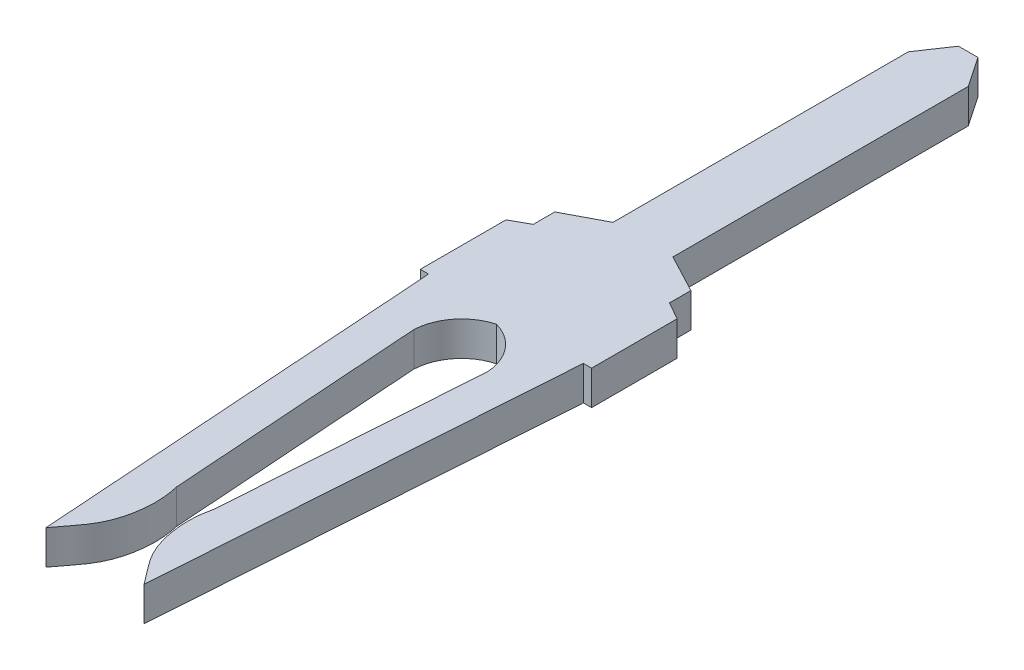
ISO-10303-21;
HEADER;
FILE_DESCRIPTION(('STEP AP214'),'2;1');
FILE_NAME('part.step','',(''),(''),'','','');
FILE_SCHEMA(('AUTOMOTIVE_DESIGN { 1 0 10303 214 1 1 1 1 }'));
ENDSEC;
DATA;
#1=APPLICATION_CONTEXT('core data for automotive mechanical design processes');
#2=APPLICATION_PROTOCOL_DEFINITION('international standard','automotive_design',2000,#1);
#3=PRODUCT_CONTEXT('',#1,'mechanical');
#4=PRODUCT('Part','Part','',(#3));
#5=PRODUCT_RELATED_PRODUCT_CATEGORY('part','',(#4));
#6=PRODUCT_DEFINITION_FORMATION('','',#4);
#7=PRODUCT_DEFINITION_CONTEXT('part definition',#1,'design');
#8=PRODUCT_DEFINITION('design','',#6,#7);
#9=PRODUCT_DEFINITION_SHAPE('','',#8);
#10=(LENGTH_UNIT() NAMED_UNIT(*) SI_UNIT(.MILLI.,.METRE.));
#11=(NAMED_UNIT(*) PLANE_ANGLE_UNIT() SI_UNIT($,.RADIAN.));
#12=(NAMED_UNIT(*) SI_UNIT($,.STERADIAN.) SOLID_ANGLE_UNIT());
#13=UNCERTAINTY_MEASURE_WITH_UNIT(LENGTH_MEASURE(1.E-05),#10,'distance_accuracy_value','');
#14=(GEOMETRIC_REPRESENTATION_CONTEXT(3) GLOBAL_UNCERTAINTY_ASSIGNED_CONTEXT((#13)) GLOBAL_UNIT_ASSIGNED_CONTEXT((#10,
#11,#12)) REPRESENTATION_CONTEXT('',''));
#15=CARTESIAN_POINT('',(0.,0.,0.));
#16=DIRECTION('',(0.,0.,1.));
#17=DIRECTION('',(1.,0.,0.));
#18=AXIS2_PLACEMENT_3D('',#15,#16,#17);
#19=CARTESIAN_POINT('',(7.14504922758908,0.200000000000005,-3.31529917991422));
#20=DIRECTION('',(-0.466469034336801,0.,0.884537528884384));
#21=DIRECTION('',(0.,1.,0.));
#22=AXIS2_PLACEMENT_3D('',#19,#20,#21);
#23=PLANE('',#22);
#24=DIRECTION('',(-0.884537528884384,0.,-0.466469034336801));
#25=VECTOR('',#24,1.);
#26=CARTESIAN_POINT('',(7.14504922758908,-0.199999999999995,-3.31529917991422));
#27=LINE('',#26,#25);
#28=CARTESIAN_POINT('',(7.14504922758908,-0.199999999999995,-3.31529917991422));
#29=VERTEX_POINT('',#28);
#30=CARTESIAN_POINT('',(6.7,-0.199999999999995,-3.55));
#31=VERTEX_POINT('',#30);
#32=EDGE_CURVE('E254',#29,#31,#27,.T.);
#33=ORIENTED_EDGE('',*,*,#32,.T.);
#34=DIRECTION('',(0.,-1.,0.));
#35=VECTOR('',#34,1.);
#36=CARTESIAN_POINT('',(6.7,0.200000000000005,-3.55));
#37=LINE('',#36,#35);
#38=CARTESIAN_POINT('',(6.7,0.200000000000005,-3.55));
#39=VERTEX_POINT('',#38);
#40=EDGE_CURVE('E340',#39,#31,#37,.T.);
#41=ORIENTED_EDGE('',*,*,#40,.F.);
#42=DIRECTION('',(-0.884537528884384,0.,-0.466469034336801));
#43=VECTOR('',#42,1.);
#44=CARTESIAN_POINT('',(7.14504922758908,0.200000000000005,-3.31529917991422));
#45=LINE('',#44,#43);
#46=CARTESIAN_POINT('',(7.14504922758908,0.200000000000005,-3.31529917991422));
#47=VERTEX_POINT('',#46);
#48=EDGE_CURVE('E312',#47,#39,#45,.T.);
#49=ORIENTED_EDGE('',*,*,#48,.F.);
#50=DIRECTION('',(0.,-1.,0.));
#51=VECTOR('',#50,1.);
#52=CARTESIAN_POINT('',(7.14504922758908,0.200000000000005,-3.31529917991422));
#53=LINE('',#52,#51);
#54=EDGE_CURVE('E11',#47,#29,#53,.T.);
#55=ORIENTED_EDGE('',*,*,#54,.T.);
#56=EDGE_LOOP('',(#33,#41,#49,#55));
#57=FACE_BOUND('',#56,.T.);
#58=ADVANCED_FACE('F16',(#57),#23,.F.);
#59=CARTESIAN_POINT('',(7.14504922758908,0.200000000000005,-3.0643625168085));
#60=DIRECTION('',(-1.,0.,0.));
#61=DIRECTION('',(0.,0.,1.));
#62=AXIS2_PLACEMENT_3D('',#59,#60,#61);
#63=PLANE('',#62);
#64=DIRECTION('',(0.,0.,-1.));
#65=VECTOR('',#64,1.);
#66=CARTESIAN_POINT('',(7.14504922758908,-0.199999999999995,-3.0643625168085));
#67=LINE('',#66,#65);
#68=CARTESIAN_POINT('',(7.14504922758908,-0.199999999999995,-3.0643625168085));
#69=VERTEX_POINT('',#68);
#70=EDGE_CURVE('E229',#69,#29,#67,.T.);
#71=ORIENTED_EDGE('',*,*,#70,.T.);
#72=ORIENTED_EDGE('',*,*,#54,.F.);
#73=DIRECTION('',(0.,0.,-1.));
#74=VECTOR('',#73,1.);
#75=CARTESIAN_POINT('',(7.14504922758908,0.200000000000005,-3.0643625168085));
#76=LINE('',#75,#74);
#77=CARTESIAN_POINT('',(7.14504922758908,0.200000000000005,-3.0643625168085));
#78=VERTEX_POINT('',#77);
#79=EDGE_CURVE('E309',#78,#47,#76,.T.);
#80=ORIENTED_EDGE('',*,*,#79,.F.);
#81=DIRECTION('',(0.,-1.,0.));
#82=VECTOR('',#81,1.);
#83=CARTESIAN_POINT('',(7.14504922758908,0.200000000000005,-3.0643625168085));
#84=LINE('',#83,#82);
#85=EDGE_CURVE('E23',#78,#69,#84,.T.);
#86=ORIENTED_EDGE('',*,*,#85,.T.);
#87=EDGE_LOOP('',(#71,#72,#80,#86));
#88=FACE_BOUND('',#87,.T.);
#89=ADVANCED_FACE('F397',(#88),#63,.F.);
#90=CARTESIAN_POINT('',(7.35,0.200000000000005,-2.95));
#91=DIRECTION('',(-0.48727320382818,0.,0.873249577630027));
#92=DIRECTION('',(0.,1.,0.));
#93=AXIS2_PLACEMENT_3D('',#90,#91,#92);
#94=PLANE('',#93);
#95=DIRECTION('',(-0.873249577630027,0.,-0.48727320382818));
#96=VECTOR('',#95,1.);
#97=CARTESIAN_POINT('',(7.35,-0.199999999999995,-2.95));
#98=LINE('',#97,#96);
#99=CARTESIAN_POINT('',(7.35,-0.199999999999995,-2.95));
#100=VERTEX_POINT('',#99);
#101=EDGE_CURVE('E225',#100,#69,#98,.T.);
#102=ORIENTED_EDGE('',*,*,#101,.T.);
#103=ORIENTED_EDGE('',*,*,#85,.F.);
#104=DIRECTION('',(-0.873249577630027,0.,-0.48727320382818));
#105=VECTOR('',#104,1.);
#106=CARTESIAN_POINT('',(7.35,0.200000000000005,-2.95));
#107=LINE('',#106,#105);
#108=CARTESIAN_POINT('',(7.35,0.200000000000005,-2.95));
#109=VERTEX_POINT('',#108);
#110=EDGE_CURVE('E306',#109,#78,#107,.T.);
#111=ORIENTED_EDGE('',*,*,#110,.F.);
#112=DIRECTION('',(0.,-1.,0.));
#113=VECTOR('',#112,1.);
#114=CARTESIAN_POINT('',(7.35,0.200000000000005,-2.95));
#115=LINE('',#114,#113);
#116=EDGE_CURVE('E276',#109,#100,#115,.T.);
#117=ORIENTED_EDGE('',*,*,#116,.T.);
#118=EDGE_LOOP('',(#102,#103,#111,#117));
#119=FACE_BOUND('',#118,.T.);
#120=ADVANCED_FACE('F386',(#119),#94,.F.);
#121=CARTESIAN_POINT('',(7.35,0.200000000000005,-1.95));
#122=DIRECTION('',(-1.,0.,0.));
#123=DIRECTION('',(0.,0.,1.));
#124=AXIS2_PLACEMENT_3D('',#121,#122,#123);
#125=PLANE('',#124);
#126=DIRECTION('',(0.,0.,-1.));
#127=VECTOR('',#126,1.);
#128=CARTESIAN_POINT('',(7.35,-0.199999999999995,-1.95));
#129=LINE('',#128,#127);
#130=CARTESIAN_POINT('',(7.35,-0.199999999999995,-1.95));
#131=VERTEX_POINT('',#130);
#132=EDGE_CURVE('E228',#131,#100,#129,.T.);
#133=ORIENTED_EDGE('',*,*,#132,.T.);
#134=ORIENTED_EDGE('',*,*,#116,.F.);
#135=DIRECTION('',(0.,0.,-1.));
#136=VECTOR('',#135,1.);
#137=CARTESIAN_POINT('',(7.35,0.200000000000005,-1.95));
#138=LINE('',#137,#136);
#139=CARTESIAN_POINT('',(7.35,0.200000000000005,-1.95));
#140=VERTEX_POINT('',#139);
#141=EDGE_CURVE('E303',#140,#109,#138,.T.);
#142=ORIENTED_EDGE('',*,*,#141,.F.);
#143=DIRECTION('',(0.,-1.,0.));
#144=VECTOR('',#143,1.);
#145=CARTESIAN_POINT('',(7.35,0.200000000000005,-1.95));
#146=LINE('',#145,#144);
#147=EDGE_CURVE('E383',#140,#131,#146,.T.);
#148=ORIENTED_EDGE('',*,*,#147,.T.);
#149=EDGE_LOOP('',(#133,#134,#142,#148));
#150=FACE_BOUND('',#149,.T.);
#151=ADVANCED_FACE('F392',(#150),#125,.F.);
#152=CARTESIAN_POINT('',(7.25406091182022,0.200000000000005,-1.95));
#153=DIRECTION('',(0.,0.,-1.));
#154=DIRECTION('',(0.,-1.,0.));
#155=AXIS2_PLACEMENT_3D('',#152,#153,#154);
#156=PLANE('',#155);
#157=DIRECTION('',(1.,0.,0.));
#158=VECTOR('',#157,1.);
#159=CARTESIAN_POINT('',(7.25406091182022,-0.199999999999995,-1.95));
#160=LINE('',#159,#158);
#161=CARTESIAN_POINT('',(7.25406091182022,-0.199999999999995,-1.95));
#162=VERTEX_POINT('',#161);
#163=EDGE_CURVE('E248',#162,#131,#160,.T.);
#164=ORIENTED_EDGE('',*,*,#163,.T.);
#165=ORIENTED_EDGE('',*,*,#147,.F.);
#166=DIRECTION('',(1.,0.,0.));
#167=VECTOR('',#166,1.);
#168=CARTESIAN_POINT('',(7.25406091182022,0.200000000000005,-1.95));
#169=LINE('',#168,#167);
#170=CARTESIAN_POINT('',(7.25406091182022,0.200000000000005,-1.95));
#171=VERTEX_POINT('',#170);
#172=EDGE_CURVE('E300',#171,#140,#169,.T.);
#173=ORIENTED_EDGE('',*,*,#172,.F.);
#174=DIRECTION('',(0.,-1.,0.));
#175=VECTOR('',#174,1.);
#176=CARTESIAN_POINT('',(7.25406091182022,0.200000000000005,-1.95));
#177=LINE('',#176,#175);
#178=EDGE_CURVE('E341',#171,#162,#177,.T.);
#179=ORIENTED_EDGE('',*,*,#178,.T.);
#180=EDGE_LOOP('',(#164,#165,#173,#179));
#181=FACE_BOUND('',#180,.T.);
#182=ADVANCED_FACE('F405',(#181),#156,.F.);
#183=CARTESIAN_POINT('',(6.7,0.200000000000005,-3.55));
#184=DIRECTION('',(-1.,0.,0.));
#185=DIRECTION('',(0.,0.,1.));
#186=AXIS2_PLACEMENT_3D('',#183,#184,#185);
#187=PLANE('',#186);
#188=DIRECTION('',(0.,0.,-1.));
#189=VECTOR('',#188,1.);
#190=CARTESIAN_POINT('',(6.7,-0.199999999999995,-3.55));
#191=LINE('',#190,#189);
#192=CARTESIAN_POINT('',(6.7,-0.199999999999995,-7.));
#193=VERTEX_POINT('',#192);
#194=EDGE_CURVE('E236',#31,#193,#191,.T.);
#195=ORIENTED_EDGE('',*,*,#194,.T.);
#196=DIRECTION('',(0.,-1.,0.));
#197=VECTOR('',#196,1.);
#198=CARTESIAN_POINT('',(6.7,0.200000000000005,-7.));
#199=LINE('',#198,#197);
#200=CARTESIAN_POINT('',(6.7,0.200000000000005,-7.));
#201=VERTEX_POINT('',#200);
#202=EDGE_CURVE('E370',#201,#193,#199,.T.);
#203=ORIENTED_EDGE('',*,*,#202,.F.);
#204=DIRECTION('',(0.,0.,-1.));
#205=VECTOR('',#204,1.);
#206=CARTESIAN_POINT('',(6.7,0.200000000000005,-3.55));
#207=LINE('',#206,#205);
#208=EDGE_CURVE('E315',#39,#201,#207,.T.);
#209=ORIENTED_EDGE('',*,*,#208,.F.);
#210=ORIENTED_EDGE('',*,*,#40,.T.);
#211=EDGE_LOOP('',(#195,#203,#209,#210));
#212=FACE_BOUND('',#211,.T.);
#213=ADVANCED_FACE('F464',(#212),#187,.F.);
#214=CARTESIAN_POINT('',(6.1940651826846,0.200000000000005,-1.27557004187954));
#215=DIRECTION('',(0.,-1.,0.));
#216=DIRECTION('',(0.,0.,-1.));
#217=AXIS2_PLACEMENT_3D('',#214,#215,#216);
#218=CYLINDRICAL_SURFACE('',#217,0.584698001459304);
#219=CARTESIAN_POINT('',(6.1940651826846,-0.199999999999995,-1.27557004187954));
#220=DIRECTION('',(0.,-1.,0.));
#221=DIRECTION('',(-1.,0.,0.));
#222=AXIS2_PLACEMENT_3D('',#219,#220,#221);
#223=CIRCLE('',#222,0.584698001459304);
#224=CARTESIAN_POINT('',(6.35,-0.199999999999995,-1.839091191136));
#225=VERTEX_POINT('',#224);
#226=CARTESIAN_POINT('',(6.77820423338275,-0.199999999999995,-1.30113021323976));
#227=VERTEX_POINT('',#226);
#228=EDGE_CURVE('E242',#225,#227,#223,.T.);
#229=ORIENTED_EDGE('',*,*,#228,.T.);
#230=DIRECTION('',(0.,-1.,0.));
#231=VECTOR('',#230,1.);
#232=CARTESIAN_POINT('',(6.77820423338275,0.200000000000005,-1.30113021323976));
#233=LINE('',#232,#231);
#234=CARTESIAN_POINT('',(6.77820423338275,0.200000000000005,-1.30113021323976));
#235=VERTEX_POINT('',#234);
#236=EDGE_CURVE('E338',#235,#227,#233,.T.);
#237=ORIENTED_EDGE('',*,*,#236,.F.);
#238=CARTESIAN_POINT('',(6.1940651826846,0.200000000000005,-1.27557004187954));
#239=DIRECTION('',(0.,-1.,0.));
#240=DIRECTION('',(-1.,0.,0.));
#241=AXIS2_PLACEMENT_3D('',#238,#239,#240);
#242=CIRCLE('',#241,0.584698001459304);
#243=CARTESIAN_POINT('',(6.35,0.200000000000005,-1.839091191136));
#244=VERTEX_POINT('',#243);
#245=EDGE_CURVE('E245',#244,#235,#242,.T.);
#246=ORIENTED_EDGE('',*,*,#245,.F.);
#247=DIRECTION('',(0.,-1.,0.));
#248=VECTOR('',#247,1.);
#249=CARTESIAN_POINT('',(6.35,0.200000000000005,-1.839091191136));
#250=LINE('',#249,#248);
#251=EDGE_CURVE('E337',#244,#225,#250,.T.);
#252=ORIENTED_EDGE('',*,*,#251,.T.);
#253=EDGE_LOOP('',(#229,#237,#246,#252));
#254=FACE_BOUND('',#253,.T.);
#255=ADVANCED_FACE('F420',(#254),#218,.F.);
#256=CARTESIAN_POINT('',(6.77820423338275,0.200000000000005,-1.30113021323976));
#257=DIRECTION('',(0.997626122448053,0.,0.0688630511178716));
#258=DIRECTION('',(0.,-1.,0.));
#259=AXIS2_PLACEMENT_3D('',#256,#257,#258);
#260=PLANE('',#259);
#261=DIRECTION('',(-0.0688630511178716,0.,0.997626122448053));
#262=VECTOR('',#261,1.);
#263=CARTESIAN_POINT('',(6.77820423338275,-0.199999999999995,-1.30113021323976));
#264=LINE('',#263,#262);
#265=CARTESIAN_POINT('',(6.57284949799642,-0.199999999999995,1.67386501372377));
#266=VERTEX_POINT('',#265);
#267=EDGE_CURVE('E215',#227,#266,#264,.T.);
#268=ORIENTED_EDGE('',*,*,#267,.T.);
#269=DIRECTION('',(0.,-1.,0.));
#270=VECTOR('',#269,1.);
#271=CARTESIAN_POINT('',(6.57284949799642,0.200000000000005,1.67386501372377));
#272=LINE('',#271,#270);
#273=CARTESIAN_POINT('',(6.57284949799642,0.200000000000005,1.67386501372377));
#274=VERTEX_POINT('',#273);
#275=EDGE_CURVE('E349',#274,#266,#272,.T.);
#276=ORIENTED_EDGE('',*,*,#275,.F.);
#277=DIRECTION('',(-0.0688630511178716,0.,0.997626122448053));
#278=VECTOR('',#277,1.);
#279=CARTESIAN_POINT('',(6.77820423338275,0.200000000000005,-1.30113021323976));
#280=LINE('',#279,#278);
#281=EDGE_CURVE('E263',#235,#274,#280,.T.);
#282=ORIENTED_EDGE('',*,*,#281,.F.);
#283=ORIENTED_EDGE('',*,*,#236,.T.);
#284=EDGE_LOOP('',(#268,#276,#282,#283));
#285=FACE_BOUND('',#284,.T.);
#286=ADVANCED_FACE('F416',(#285),#260,.F.);
#287=CARTESIAN_POINT('',(6.9227317315511,0.200000000000005,2.85));
#288=DIRECTION('',(-0.997626122448053,0.,-0.0688630511178712));
#289=DIRECTION('',(-0.0688630511178712,0.,0.997626122448053));
#290=AXIS2_PLACEMENT_3D('',#287,#288,#289);
#291=PLANE('',#290);
#292=DIRECTION('',(0.0688630511178712,0.,-0.997626122448053));
#293=VECTOR('',#292,1.);
#294=CARTESIAN_POINT('',(6.9227317315511,-0.199999999999995,2.85));
#295=LINE('',#294,#293);
#296=CARTESIAN_POINT('',(6.9227317315511,-0.199999999999995,2.85));
#297=VERTEX_POINT('',#296);
#298=EDGE_CURVE('E216',#297,#162,#295,.T.);
#299=ORIENTED_EDGE('',*,*,#298,.T.);
#300=ORIENTED_EDGE('',*,*,#178,.F.);
#301=DIRECTION('',(0.0688630511178712,0.,-0.997626122448053));
#302=VECTOR('',#301,1.);
#303=CARTESIAN_POINT('',(6.9227317315511,0.200000000000005,2.85));
#304=LINE('',#303,#302);
#305=CARTESIAN_POINT('',(6.9227317315511,0.200000000000005,2.85));
#306=VERTEX_POINT('',#305);
#307=EDGE_CURVE('E294',#306,#171,#304,.T.);
#308=ORIENTED_EDGE('',*,*,#307,.F.);
#309=DIRECTION('',(0.,-1.,0.));
#310=VECTOR('',#309,1.);
#311=CARTESIAN_POINT('',(6.9227317315511,0.200000000000005,2.85));
#312=LINE('',#311,#310);
#313=EDGE_CURVE('E350',#306,#297,#312,.T.);
#314=ORIENTED_EDGE('',*,*,#313,.T.);
#315=EDGE_LOOP('',(#299,#300,#308,#314));
#316=FACE_BOUND('',#315,.T.);
#317=ADVANCED_FACE('F410',(#316),#291,.F.);
#318=CARTESIAN_POINT('',(6.57284949799642,0.200000000000005,1.67386501372377));
#319=CARTESIAN_POINT('',(6.53798539804515,0.200000000000005,1.835112980862));
#320=CARTESIAN_POINT('',(6.53144115427702,0.200000000000005,2.11077566439518));
#321=CARTESIAN_POINT('',(6.62153964419782,0.200000000000005,2.49313848213162));
#322=CARTESIAN_POINT('',(6.84632285896388,0.200000000000005,2.74017511614905));
#323=CARTESIAN_POINT('',(6.9227317315511,0.200000000000005,2.85));
#324=(BOUNDED_CURVE() B_SPLINE_CURVE(3,(#318,#319,#320,#321,#322,#323),.UNSPECIFIED.,.F.,
.F.) B_SPLINE_CURVE_WITH_KNOTS((4,1,1,4),(0.,0.233999874933255,0.693587506264288,1.),
.UNSPECIFIED.) CURVE() GEOMETRIC_REPRESENTATION_ITEM() RATIONAL_B_SPLINE_CURVE((1.,1.,1.,1.,1.,1.)) REPRESENTATION_ITEM(''));
#325=DIRECTION('',(0.,-1.,0.));
#326=VECTOR('',#325,1.);
#327=SURFACE_OF_LINEAR_EXTRUSION('',#324,#326);
#328=CARTESIAN_POINT('',(6.57284949799642,-0.199999999999995,1.67386501372377));
#329=CARTESIAN_POINT('',(6.53798539804515,-0.199999999999995,1.835112980862));
#330=CARTESIAN_POINT('',(6.53144115427702,-0.199999999999995,2.11077566439518));
#331=CARTESIAN_POINT('',(6.62153964419782,-0.199999999999995,2.49313848213162));
#332=CARTESIAN_POINT('',(6.84632285896388,-0.199999999999995,2.74017511614905));
#333=CARTESIAN_POINT('',(6.9227317315511,-0.199999999999995,2.85));
#334=(BOUNDED_CURVE() B_SPLINE_CURVE(3,(#328,#329,#330,#331,#332,#333),.UNSPECIFIED.,.F.,
.F.) B_SPLINE_CURVE_WITH_KNOTS((4,1,1,4),(0.,0.233999874933255,0.693587506264288,1.),
.UNSPECIFIED.) CURVE() GEOMETRIC_REPRESENTATION_ITEM() RATIONAL_B_SPLINE_CURVE((1.,1.,1.,1.,1.,1.)) REPRESENTATION_ITEM(''));
#335=EDGE_CURVE('E210',#266,#297,#334,.T.);
#336=ORIENTED_EDGE('',*,*,#335,.T.);
#337=ORIENTED_EDGE('',*,*,#313,.F.);
#338=CARTESIAN_POINT('',(6.57284949799642,0.200000000000005,1.67386501372377));
#339=CARTESIAN_POINT('',(6.53798539804515,0.200000000000005,1.835112980862));
#340=CARTESIAN_POINT('',(6.53144115427702,0.200000000000005,2.11077566439518));
#341=CARTESIAN_POINT('',(6.62153964419782,0.200000000000005,2.49313848213162));
#342=CARTESIAN_POINT('',(6.84632285896388,0.200000000000005,2.74017511614905));
#343=CARTESIAN_POINT('',(6.9227317315511,0.200000000000005,2.85));
#344=(BOUNDED_CURVE() B_SPLINE_CURVE(3,(#338,#339,#340,#341,#342,#343),.UNSPECIFIED.,.F.,
.F.) B_SPLINE_CURVE_WITH_KNOTS((4,1,1,4),(0.,0.233999874933255,0.693587506264288,1.),
.UNSPECIFIED.) CURVE() GEOMETRIC_REPRESENTATION_ITEM() RATIONAL_B_SPLINE_CURVE((1.,1.,1.,1.,1.,1.)) REPRESENTATION_ITEM(''));
#345=EDGE_CURVE('E274',#274,#306,#344,.T.);
#346=ORIENTED_EDGE('',*,*,#345,.F.);
#347=ORIENTED_EDGE('',*,*,#275,.T.);
#348=EDGE_LOOP('',(#336,#337,#346,#347));
#349=FACE_BOUND('',#348,.T.);
#350=ADVANCED_FACE('F413',(#349),#327,.F.);
#351=CARTESIAN_POINT('',(6.35,0.200000000000005,-7.35));
#352=DIRECTION('',(0.,0.,1.));
#353=DIRECTION('',(1.,0.,0.));
#354=AXIS2_PLACEMENT_3D('',#351,#352,#353);
#355=PLANE('',#354);
#356=DIRECTION('',(-1.,0.,0.));
#357=VECTOR('',#356,1.);
#358=CARTESIAN_POINT('',(6.35,-0.199999999999995,-7.35));
#359=LINE('',#358,#357);
#360=CARTESIAN_POINT('',(6.46387375339661,-0.199999999999995,-7.35));
#361=VERTEX_POINT('',#360);
#362=CARTESIAN_POINT('',(6.23612624660339,-0.199999999999995,-7.35));
#363=VERTEX_POINT('',#362);
#364=EDGE_CURVE('E170',#361,#363,#359,.T.);
#365=ORIENTED_EDGE('',*,*,#364,.T.);
#366=DIRECTION('',(0.,-1.,0.));
#367=VECTOR('',#366,1.);
#368=CARTESIAN_POINT('',(6.23612624660339,0.200000000000005,-7.35));
#369=LINE('',#368,#367);
#370=CARTESIAN_POINT('',(6.23612624660339,0.200000000000005,-7.35));
#371=VERTEX_POINT('',#370);
#372=EDGE_CURVE('E174',#371,#363,#369,.T.);
#373=ORIENTED_EDGE('',*,*,#372,.F.);
#374=DIRECTION('',(-1.,0.,0.));
#375=VECTOR('',#374,1.);
#376=CARTESIAN_POINT('',(6.35,0.200000000000005,-7.35));
#377=LINE('',#376,#375);
#378=CARTESIAN_POINT('',(6.46387375339661,0.200000000000005,-7.35));
#379=VERTEX_POINT('',#378);
#380=EDGE_CURVE('E323',#379,#371,#377,.T.);
#381=ORIENTED_EDGE('',*,*,#380,.F.);
#382=DIRECTION('',(0.,-1.,0.));
#383=VECTOR('',#382,1.);
#384=CARTESIAN_POINT('',(6.46387375339661,0.200000000000005,-7.35));
#385=LINE('',#384,#383);
#386=EDGE_CURVE('E176',#379,#361,#385,.T.);
#387=ORIENTED_EDGE('',*,*,#386,.T.);
#388=EDGE_LOOP('',(#365,#373,#381,#387));
#389=FACE_BOUND('',#388,.T.);
#390=ADVANCED_FACE('F172',(#389),#355,.F.);
#391=CARTESIAN_POINT('',(6.7,0.200000000000005,-7.));
#392=DIRECTION('',(-0.828984571628172,0.,0.559271472544824));
#393=DIRECTION('',(0.,1.,0.));
#394=AXIS2_PLACEMENT_3D('',#391,#392,#393);
#395=PLANE('',#394);
#396=DIRECTION('',(-0.559271472544824,0.,-0.828984571628172));
#397=VECTOR('',#396,1.);
#398=CARTESIAN_POINT('',(6.7,-0.199999999999995,-7.));
#399=LINE('',#398,#397);
#400=EDGE_CURVE('E181',#193,#361,#399,.T.);
#401=ORIENTED_EDGE('',*,*,#400,.T.);
#402=ORIENTED_EDGE('',*,*,#386,.F.);
#403=DIRECTION('',(-0.559271472544824,0.,-0.828984571628172));
#404=VECTOR('',#403,1.);
#405=CARTESIAN_POINT('',(6.7,0.200000000000005,-7.));
#406=LINE('',#405,#404);
#407=EDGE_CURVE('E320',#201,#379,#406,.T.);
#408=ORIENTED_EDGE('',*,*,#407,.F.);
#409=ORIENTED_EDGE('',*,*,#202,.T.);
#410=EDGE_LOOP('',(#401,#402,#408,#409));
#411=FACE_BOUND('',#410,.T.);
#412=ADVANCED_FACE('F467',(#411),#395,.F.);
#413=CARTESIAN_POINT('',(6.,0.200000000000005,-7.));
#414=DIRECTION('',(1.,0.,0.));
#415=DIRECTION('',(0.,1.,0.));
#416=AXIS2_PLACEMENT_3D('',#413,#414,#415);
#417=PLANE('',#416);
#418=DIRECTION('',(0.,0.,1.));
#419=VECTOR('',#418,1.);
#420=CARTESIAN_POINT('',(6.,-0.199999999999995,-7.));
#421=LINE('',#420,#419);
#422=CARTESIAN_POINT('',(6.,-0.199999999999995,-7.));
#423=VERTEX_POINT('',#422);
#424=CARTESIAN_POINT('',(6.,-0.199999999999995,-3.55));
#425=VERTEX_POINT('',#424);
#426=EDGE_CURVE('E195',#423,#425,#421,.T.);
#427=ORIENTED_EDGE('',*,*,#426,.T.);
#428=DIRECTION('',(0.,-1.,0.));
#429=VECTOR('',#428,1.);
#430=CARTESIAN_POINT('',(6.,0.200000000000005,-3.55));
#431=LINE('',#430,#429);
#432=CARTESIAN_POINT('',(6.,0.200000000000005,-3.55));
#433=VERTEX_POINT('',#432);
#434=EDGE_CURVE('E182',#433,#425,#431,.T.);
#435=ORIENTED_EDGE('',*,*,#434,.F.);
#436=DIRECTION('',(0.,0.,1.));
#437=VECTOR('',#436,1.);
#438=CARTESIAN_POINT('',(6.,0.200000000000005,-7.));
#439=LINE('',#438,#437);
#440=CARTESIAN_POINT('',(6.,0.200000000000005,-7.));
#441=VERTEX_POINT('',#440);
#442=EDGE_CURVE('E191',#441,#433,#439,.T.);
#443=ORIENTED_EDGE('',*,*,#442,.F.);
#444=DIRECTION('',(0.,-1.,0.));
#445=VECTOR('',#444,1.);
#446=CARTESIAN_POINT('',(6.,0.200000000000005,-7.));
#447=LINE('',#446,#445);
#448=EDGE_CURVE('E197',#441,#423,#447,.T.);
#449=ORIENTED_EDGE('',*,*,#448,.T.);
#450=EDGE_LOOP('',(#427,#435,#443,#449));
#451=FACE_BOUND('',#450,.T.);
#452=ADVANCED_FACE('F469',(#451),#417,.F.);
#453=CARTESIAN_POINT('',(5.35,0.200000000000005,-2.95));
#454=DIRECTION('',(1.,0.,0.));
#455=DIRECTION('',(0.,1.,0.));
#456=AXIS2_PLACEMENT_3D('',#453,#454,#455);
#457=PLANE('',#456);
#458=DIRECTION('',(0.,0.,1.));
#459=VECTOR('',#458,1.);
#460=CARTESIAN_POINT('',(5.35,-0.199999999999995,-2.95));
#461=LINE('',#460,#459);
#462=CARTESIAN_POINT('',(5.35,-0.199999999999995,-2.95));
#463=VERTEX_POINT('',#462);
#464=CARTESIAN_POINT('',(5.35,-0.199999999999995,-1.95));
#465=VERTEX_POINT('',#464);
#466=EDGE_CURVE('E364',#463,#465,#461,.T.);
#467=ORIENTED_EDGE('',*,*,#466,.T.);
#468=DIRECTION('',(0.,-1.,0.));
#469=VECTOR('',#468,1.);
#470=CARTESIAN_POINT('',(5.35,0.200000000000005,-1.95));
#471=LINE('',#470,#469);
#472=CARTESIAN_POINT('',(5.35,0.200000000000005,-1.95));
#473=VERTEX_POINT('',#472);
#474=EDGE_CURVE('E378',#473,#465,#471,.T.);
#475=ORIENTED_EDGE('',*,*,#474,.F.);
#476=DIRECTION('',(0.,0.,1.));
#477=VECTOR('',#476,1.);
#478=CARTESIAN_POINT('',(5.35,0.200000000000005,-2.95));
#479=LINE('',#478,#477);
#480=CARTESIAN_POINT('',(5.35,0.200000000000005,-2.95));
#481=VERTEX_POINT('',#480);
#482=EDGE_CURVE('E230',#481,#473,#479,.T.);
#483=ORIENTED_EDGE('',*,*,#482,.F.);
#484=DIRECTION('',(0.,-1.,0.));
#485=VECTOR('',#484,1.);
#486=CARTESIAN_POINT('',(5.35,0.200000000000005,-2.95));
#487=LINE('',#486,#485);
#488=EDGE_CURVE('E38',#481,#463,#487,.T.);
#489=ORIENTED_EDGE('',*,*,#488,.T.);
#490=EDGE_LOOP('',(#467,#475,#483,#489));
#491=FACE_BOUND('',#490,.T.);
#492=ADVANCED_FACE('F441',(#491),#457,.F.);
#493=CARTESIAN_POINT('',(5.35,0.200000000000005,-1.95));
#494=DIRECTION('',(0.,0.,-1.));
#495=DIRECTION('',(-1.,0.,0.));
#496=AXIS2_PLACEMENT_3D('',#493,#494,#495);
#497=PLANE('',#496);
#498=DIRECTION('',(1.,0.,0.));
#499=VECTOR('',#498,1.);
#500=CARTESIAN_POINT('',(5.35,-0.199999999999995,-1.95));
#501=LINE('',#500,#499);
#502=CARTESIAN_POINT('',(5.44593908817977,-0.199999999999995,-1.95));
#503=VERTEX_POINT('',#502);
#504=EDGE_CURVE('E361',#465,#503,#501,.T.);
#505=ORIENTED_EDGE('',*,*,#504,.T.);
#506=DIRECTION('',(0.,-1.,0.));
#507=VECTOR('',#506,1.);
#508=CARTESIAN_POINT('',(5.44593908817977,0.200000000000005,-1.95));
#509=LINE('',#508,#507);
#510=CARTESIAN_POINT('',(5.44593908817977,0.200000000000005,-1.95));
#511=VERTEX_POINT('',#510);
#512=EDGE_CURVE('E376',#511,#503,#509,.T.);
#513=ORIENTED_EDGE('',*,*,#512,.F.);
#514=DIRECTION('',(1.,0.,0.));
#515=VECTOR('',#514,1.);
#516=CARTESIAN_POINT('',(5.35,0.200000000000005,-1.95));
#517=LINE('',#516,#515);
#518=EDGE_CURVE('E233',#473,#511,#517,.T.);
#519=ORIENTED_EDGE('',*,*,#518,.F.);
#520=ORIENTED_EDGE('',*,*,#474,.T.);
#521=EDGE_LOOP('',(#505,#513,#519,#520));
#522=FACE_BOUND('',#521,.T.);
#523=ADVANCED_FACE('F438',(#522),#497,.F.);
#524=CARTESIAN_POINT('',(5.44593908817977,0.200000000000005,-1.95));
#525=DIRECTION('',(0.997626122448053,0.,-0.0688630511178712));
#526=DIRECTION('',(0.,-1.,0.));
#527=AXIS2_PLACEMENT_3D('',#524,#525,#526);
#528=PLANE('',#527);
#529=DIRECTION('',(0.0688630511178712,0.,0.997626122448053));
#530=VECTOR('',#529,1.);
#531=CARTESIAN_POINT('',(5.44593908817977,-0.199999999999995,-1.95));
#532=LINE('',#531,#530);
#533=CARTESIAN_POINT('',(5.7772682684489,-0.199999999999995,2.85));
#534=VERTEX_POINT('',#533);
#535=EDGE_CURVE('E355',#503,#534,#532,.T.);
#536=ORIENTED_EDGE('',*,*,#535,.T.);
#537=DIRECTION('',(0.,-1.,0.));
#538=VECTOR('',#537,1.);
#539=CARTESIAN_POINT('',(5.7772682684489,0.200000000000005,2.85));
#540=LINE('',#539,#538);
#541=CARTESIAN_POINT('',(5.7772682684489,0.200000000000005,2.85));
#542=VERTEX_POINT('',#541);
#543=EDGE_CURVE('E317',#542,#534,#540,.T.);
#544=ORIENTED_EDGE('',*,*,#543,.F.);
#545=DIRECTION('',(0.0688630511178712,0.,0.997626122448053));
#546=VECTOR('',#545,1.);
#547=CARTESIAN_POINT('',(5.44593908817977,0.200000000000005,-1.95));
#548=LINE('',#547,#546);
#549=EDGE_CURVE('E251',#511,#542,#548,.T.);
#550=ORIENTED_EDGE('',*,*,#549,.F.);
#551=ORIENTED_EDGE('',*,*,#512,.T.);
#552=EDGE_LOOP('',(#536,#544,#550,#551));
#553=FACE_BOUND('',#552,.T.);
#554=ADVANCED_FACE('F435',(#553),#528,.F.);
#555=CARTESIAN_POINT('',(5.7772682684489,0.200000000000005,2.85));
#556=CARTESIAN_POINT('',(5.85367714103612,0.200000000000005,2.74017511614905));
#557=CARTESIAN_POINT('',(6.07846035580218,0.200000000000005,2.49313848213162));
#558=CARTESIAN_POINT('',(6.16855884572298,0.200000000000005,2.11077566439518));
#559=CARTESIAN_POINT('',(6.16201460195485,0.200000000000005,1.835112980862));
#560=CARTESIAN_POINT('',(6.12715050200358,0.200000000000005,1.67386501372377));
#561=(BOUNDED_CURVE() B_SPLINE_CURVE(3,(#555,#556,#557,#558,#559,#560),.UNSPECIFIED.,.F.,
.F.) B_SPLINE_CURVE_WITH_KNOTS((4,1,1,4),(0.,0.306412493735712,0.766000125066746,1.),
.UNSPECIFIED.) CURVE() GEOMETRIC_REPRESENTATION_ITEM() RATIONAL_B_SPLINE_CURVE((1.,1.,1.,1.,1.,1.)) REPRESENTATION_ITEM(''));
#562=DIRECTION('',(0.,-1.,0.));
#563=VECTOR('',#562,1.);
#564=SURFACE_OF_LINEAR_EXTRUSION('',#561,#563);
#565=CARTESIAN_POINT('',(5.7772682684489,-0.199999999999995,2.85));
#566=CARTESIAN_POINT('',(5.85367714103612,-0.199999999999995,2.74017511614905));
#567=CARTESIAN_POINT('',(6.07846035580218,-0.199999999999995,2.49313848213162));
#568=CARTESIAN_POINT('',(6.16855884572298,-0.199999999999995,2.11077566439518));
#569=CARTESIAN_POINT('',(6.16201460195485,-0.199999999999995,1.835112980862));
#570=CARTESIAN_POINT('',(6.12715050200358,-0.199999999999995,1.67386501372377));
#571=(BOUNDED_CURVE() B_SPLINE_CURVE(3,(#565,#566,#567,#568,#569,#570),.UNSPECIFIED.,.F.,
.F.) B_SPLINE_CURVE_WITH_KNOTS((4,1,1,4),(0.,0.306412493735712,0.766000125066746,1.),
.UNSPECIFIED.) CURVE() GEOMETRIC_REPRESENTATION_ITEM() RATIONAL_B_SPLINE_CURVE((1.,1.,1.,1.,1.,1.)) REPRESENTATION_ITEM(''));
#572=CARTESIAN_POINT('',(6.12715050200358,-0.199999999999995,1.67386501372377));
#573=VERTEX_POINT('',#572);
#574=EDGE_CURVE('E260',#534,#573,#571,.T.);
#575=ORIENTED_EDGE('',*,*,#574,.T.);
#576=DIRECTION('',(0.,-1.,0.));
#577=VECTOR('',#576,1.);
#578=CARTESIAN_POINT('',(6.12715050200358,0.200000000000005,1.67386501372377));
#579=LINE('',#578,#577);
#580=CARTESIAN_POINT('',(6.12715050200358,0.200000000000005,1.67386501372377));
#581=VERTEX_POINT('',#580);
#582=EDGE_CURVE('E331',#581,#573,#579,.T.);
#583=ORIENTED_EDGE('',*,*,#582,.F.);
#584=CARTESIAN_POINT('',(5.7772682684489,0.200000000000005,2.85));
#585=CARTESIAN_POINT('',(5.85367714103612,0.200000000000005,2.74017511614905));
#586=CARTESIAN_POINT('',(6.07846035580218,0.200000000000005,2.49313848213162));
#587=CARTESIAN_POINT('',(6.16855884572298,0.200000000000005,2.11077566439518));
#588=CARTESIAN_POINT('',(6.16201460195485,0.200000000000005,1.835112980862));
#589=CARTESIAN_POINT('',(6.12715050200358,0.200000000000005,1.67386501372377));
#590=(BOUNDED_CURVE() B_SPLINE_CURVE(3,(#584,#585,#586,#587,#588,#589),.UNSPECIFIED.,.F.,
.F.) B_SPLINE_CURVE_WITH_KNOTS((4,1,1,4),(0.,0.306412493735712,0.766000125066746,1.),
.UNSPECIFIED.) CURVE() GEOMETRIC_REPRESENTATION_ITEM() RATIONAL_B_SPLINE_CURVE((1.,1.,1.,1.,1.,1.)) REPRESENTATION_ITEM(''));
#591=EDGE_CURVE('E224',#542,#581,#590,.T.);
#592=ORIENTED_EDGE('',*,*,#591,.F.);
#593=ORIENTED_EDGE('',*,*,#543,.T.);
#594=EDGE_LOOP('',(#575,#583,#592,#593));
#595=FACE_BOUND('',#594,.T.);
#596=ADVANCED_FACE('F431',(#595),#564,.F.);
#597=CARTESIAN_POINT('',(5.55495077241092,0.200000000000005,-3.0643625168085));
#598=DIRECTION('',(0.48727320382818,0.,0.873249577630027));
#599=DIRECTION('',(0.,-1.,0.));
#600=AXIS2_PLACEMENT_3D('',#597,#598,#599);
#601=PLANE('',#600);
#602=DIRECTION('',(-0.873249577630027,0.,0.48727320382818));
#603=VECTOR('',#602,1.);
#604=CARTESIAN_POINT('',(5.55495077241092,-0.199999999999995,-3.0643625168085));
#605=LINE('',#604,#603);
#606=CARTESIAN_POINT('',(5.55495077241092,-0.199999999999995,-3.0643625168085));
#607=VERTEX_POINT('',#606);
#608=EDGE_CURVE('E366',#607,#463,#605,.T.);
#609=ORIENTED_EDGE('',*,*,#608,.T.);
#610=ORIENTED_EDGE('',*,*,#488,.F.);
#611=DIRECTION('',(-0.873249577630027,0.,0.48727320382818));
#612=VECTOR('',#611,1.);
#613=CARTESIAN_POINT('',(5.55495077241092,0.200000000000005,-3.0643625168085));
#614=LINE('',#613,#612);
#615=CARTESIAN_POINT('',(5.55495077241092,0.200000000000005,-3.0643625168085));
#616=VERTEX_POINT('',#615);
#617=EDGE_CURVE('E234',#616,#481,#614,.T.);
#618=ORIENTED_EDGE('',*,*,#617,.F.);
#619=DIRECTION('',(0.,-1.,0.));
#620=VECTOR('',#619,1.);
#621=CARTESIAN_POINT('',(5.55495077241092,0.200000000000005,-3.0643625168085));
#622=LINE('',#621,#620);
#623=EDGE_CURVE('E30',#616,#607,#622,.T.);
#624=ORIENTED_EDGE('',*,*,#623,.T.);
#625=EDGE_LOOP('',(#609,#610,#618,#624));
#626=FACE_BOUND('',#625,.T.);
#627=ADVANCED_FACE('F443',(#626),#601,.F.);
#628=CARTESIAN_POINT('',(5.55495077241092,0.200000000000005,-3.31529917991422));
#629=DIRECTION('',(1.,0.,0.));
#630=DIRECTION('',(0.,1.,0.));
#631=AXIS2_PLACEMENT_3D('',#628,#629,#630);
#632=PLANE('',#631);
#633=DIRECTION('',(0.,0.,1.));
#634=VECTOR('',#633,1.);
#635=CARTESIAN_POINT('',(5.55495077241092,-0.199999999999995,-3.31529917991422));
#636=LINE('',#635,#634);
#637=CARTESIAN_POINT('',(5.55495077241092,-0.199999999999995,-3.31529917991422));
#638=VERTEX_POINT('',#637);
#639=EDGE_CURVE('E368',#638,#607,#636,.T.);
#640=ORIENTED_EDGE('',*,*,#639,.T.);
#641=ORIENTED_EDGE('',*,*,#623,.F.);
#642=DIRECTION('',(0.,0.,1.));
#643=VECTOR('',#642,1.);
#644=CARTESIAN_POINT('',(5.55495077241092,0.200000000000005,-3.31529917991422));
#645=LINE('',#644,#643);
#646=CARTESIAN_POINT('',(5.55495077241092,0.200000000000005,-3.31529917991422));
#647=VERTEX_POINT('',#646);
#648=EDGE_CURVE('E257',#647,#616,#645,.T.);
#649=ORIENTED_EDGE('',*,*,#648,.F.);
#650=DIRECTION('',(0.,-1.,0.));
#651=VECTOR('',#650,1.);
#652=CARTESIAN_POINT('',(5.55495077241092,0.200000000000005,-3.31529917991422));
#653=LINE('',#652,#651);
#654=EDGE_CURVE('E208',#647,#638,#653,.T.);
#655=ORIENTED_EDGE('',*,*,#654,.T.);
#656=EDGE_LOOP('',(#640,#641,#649,#655));
#657=FACE_BOUND('',#656,.T.);
#658=ADVANCED_FACE('F445',(#657),#632,.F.);
#659=CARTESIAN_POINT('',(6.10384830377143,-0.199999999999995,2.32610141229193));
#660=DIRECTION('',(0.,1.,0.));
#661=DIRECTION('',(1.,0.,0.));
#662=AXIS2_PLACEMENT_3D('',#659,#660,#661);
#663=PLANE('',#662);
#664=DIRECTION('',(-0.559271472544824,0.,0.828984571628172));
#665=VECTOR('',#664,1.);
#666=CARTESIAN_POINT('',(6.23612624660339,-0.199999999999995,-7.35));
#667=LINE('',#666,#665);
#668=EDGE_CURVE('E188',#363,#423,#667,.T.);
#669=ORIENTED_EDGE('',*,*,#668,.F.);
#670=ORIENTED_EDGE('',*,*,#364,.F.);
#671=ORIENTED_EDGE('',*,*,#400,.F.);
#672=ORIENTED_EDGE('',*,*,#194,.F.);
#673=ORIENTED_EDGE('',*,*,#32,.F.);
#674=ORIENTED_EDGE('',*,*,#70,.F.);
#675=ORIENTED_EDGE('',*,*,#101,.F.);
#676=ORIENTED_EDGE('',*,*,#132,.F.);
#677=ORIENTED_EDGE('',*,*,#163,.F.);
#678=ORIENTED_EDGE('',*,*,#298,.F.);
#679=ORIENTED_EDGE('',*,*,#335,.F.);
#680=ORIENTED_EDGE('',*,*,#267,.F.);
#681=ORIENTED_EDGE('',*,*,#228,.F.);
#682=CARTESIAN_POINT('',(6.5059348173154,-0.199999999999995,-1.27557004187954));
#683=DIRECTION('',(0.,-1.,0.));
#684=DIRECTION('',(1.,0.,0.));
#685=AXIS2_PLACEMENT_3D('',#682,#683,#684);
#686=CIRCLE('',#685,0.584698001459304);
#687=CARTESIAN_POINT('',(5.92179576661725,-0.199999999999995,-1.30113021323976));
#688=VERTEX_POINT('',#687);
#689=EDGE_CURVE('E334',#688,#225,#686,.T.);
#690=ORIENTED_EDGE('',*,*,#689,.F.);
#691=DIRECTION('',(-0.0688630511178716,0.,-0.997626122448053));
#692=VECTOR('',#691,1.);
#693=CARTESIAN_POINT('',(6.12715050200358,-0.199999999999995,1.67386501372377));
#694=LINE('',#693,#692);
#695=EDGE_CURVE('E325',#573,#688,#694,.T.);
#696=ORIENTED_EDGE('',*,*,#695,.F.);
#697=ORIENTED_EDGE('',*,*,#574,.F.);
#698=ORIENTED_EDGE('',*,*,#535,.F.);
#699=ORIENTED_EDGE('',*,*,#504,.F.);
#700=ORIENTED_EDGE('',*,*,#466,.F.);
#701=ORIENTED_EDGE('',*,*,#608,.F.);
#702=ORIENTED_EDGE('',*,*,#639,.F.);
#703=DIRECTION('',(-0.884537528884384,0.,0.466469034336801));
#704=VECTOR('',#703,1.);
#705=CARTESIAN_POINT('',(6.,-0.199999999999995,-3.55));
#706=LINE('',#705,#704);
#707=EDGE_CURVE('E344',#425,#638,#706,.T.);
#708=ORIENTED_EDGE('',*,*,#707,.F.);
#709=ORIENTED_EDGE('',*,*,#426,.F.);
#710=EDGE_LOOP('',(#669,#670,#671,#672,#673,#674,#675,#676,#677,#678,#679,#680,#681,#690,#696,
#697,#698,#699,#700,#701,#702,#708,#709));
#711=FACE_BOUND('',#710,.T.);
#712=ADVANCED_FACE('F193',(#711),#663,.F.);
#713=CARTESIAN_POINT('',(6.,0.200000000000005,-3.55));
#714=DIRECTION('',(0.466469034336801,0.,0.884537528884384));
#715=DIRECTION('',(0.,-1.,0.));
#716=AXIS2_PLACEMENT_3D('',#713,#714,#715);
#717=PLANE('',#716);
#718=ORIENTED_EDGE('',*,*,#707,.T.);
#719=ORIENTED_EDGE('',*,*,#654,.F.);
#720=DIRECTION('',(-0.884537528884384,0.,0.466469034336801));
#721=VECTOR('',#720,1.);
#722=CARTESIAN_POINT('',(6.,0.200000000000005,-3.55));
#723=LINE('',#722,#721);
#724=EDGE_CURVE('E239',#433,#647,#723,.T.);
#725=ORIENTED_EDGE('',*,*,#724,.F.);
#726=ORIENTED_EDGE('',*,*,#434,.T.);
#727=EDGE_LOOP('',(#718,#719,#725,#726));
#728=FACE_BOUND('',#727,.T.);
#729=ADVANCED_FACE('F478',(#728),#717,.F.);
#730=CARTESIAN_POINT('',(6.5059348173154,0.200000000000005,-1.27557004187954));
#731=DIRECTION('',(0.,-1.,0.));
#732=DIRECTION('',(0.,0.,-1.));
#733=AXIS2_PLACEMENT_3D('',#730,#731,#732);
#734=CYLINDRICAL_SURFACE('',#733,0.584698001459304);
#735=ORIENTED_EDGE('',*,*,#689,.T.);
#736=ORIENTED_EDGE('',*,*,#251,.F.);
#737=CARTESIAN_POINT('',(6.5059348173154,0.200000000000005,-1.27557004187954));
#738=DIRECTION('',(0.,-1.,0.));
#739=DIRECTION('',(1.,0.,0.));
#740=AXIS2_PLACEMENT_3D('',#737,#738,#739);
#741=CIRCLE('',#740,0.584698001459304);
#742=CARTESIAN_POINT('',(5.92179576661725,0.200000000000005,-1.30113021323976));
#743=VERTEX_POINT('',#742);
#744=EDGE_CURVE('E223',#743,#244,#741,.T.);
#745=ORIENTED_EDGE('',*,*,#744,.F.);
#746=DIRECTION('',(0.,-1.,0.));
#747=VECTOR('',#746,1.);
#748=CARTESIAN_POINT('',(5.92179576661725,0.200000000000005,-1.30113021323976));
#749=LINE('',#748,#747);
#750=EDGE_CURVE('E328',#743,#688,#749,.T.);
#751=ORIENTED_EDGE('',*,*,#750,.T.);
#752=EDGE_LOOP('',(#735,#736,#745,#751));
#753=FACE_BOUND('',#752,.T.);
#754=ADVANCED_FACE('F423',(#753),#734,.F.);
#755=CARTESIAN_POINT('',(6.12715050200358,0.200000000000005,1.67386501372377));
#756=DIRECTION('',(-0.997626122448053,0.,0.0688630511178716));
#757=DIRECTION('',(0.,1.,0.));
#758=AXIS2_PLACEMENT_3D('',#755,#756,#757);
#759=PLANE('',#758);
#760=ORIENTED_EDGE('',*,*,#695,.T.);
#761=ORIENTED_EDGE('',*,*,#750,.F.);
#762=DIRECTION('',(-0.0688630511178716,0.,-0.997626122448053));
#763=VECTOR('',#762,1.);
#764=CARTESIAN_POINT('',(6.12715050200358,0.200000000000005,1.67386501372377));
#765=LINE('',#764,#763);
#766=EDGE_CURVE('E217',#581,#743,#765,.T.);
#767=ORIENTED_EDGE('',*,*,#766,.F.);
#768=ORIENTED_EDGE('',*,*,#582,.T.);
#769=EDGE_LOOP('',(#760,#761,#767,#768));
#770=FACE_BOUND('',#769,.T.);
#771=ADVANCED_FACE('F426',(#770),#759,.F.);
#772=CARTESIAN_POINT('',(6.10384830377143,0.200000000000005,2.32610141229193));
#773=DIRECTION('',(0.,1.,0.));
#774=DIRECTION('',(1.,0.,0.));
#775=AXIS2_PLACEMENT_3D('',#772,#773,#774);
#776=PLANE('',#775);
#777=DIRECTION('',(-0.559271472544824,0.,0.828984571628172));
#778=VECTOR('',#777,1.);
#779=CARTESIAN_POINT('',(6.23612624660339,0.200000000000005,-7.35));
#780=LINE('',#779,#778);
#781=EDGE_CURVE('E190',#371,#441,#780,.T.);
#782=ORIENTED_EDGE('',*,*,#781,.T.);
#783=ORIENTED_EDGE('',*,*,#442,.T.);
#784=ORIENTED_EDGE('',*,*,#724,.T.);
#785=ORIENTED_EDGE('',*,*,#648,.T.);
#786=ORIENTED_EDGE('',*,*,#617,.T.);
#787=ORIENTED_EDGE('',*,*,#482,.T.);
#788=ORIENTED_EDGE('',*,*,#518,.T.);
#789=ORIENTED_EDGE('',*,*,#549,.T.);
#790=ORIENTED_EDGE('',*,*,#591,.T.);
#791=ORIENTED_EDGE('',*,*,#766,.T.);
#792=ORIENTED_EDGE('',*,*,#744,.T.);
#793=ORIENTED_EDGE('',*,*,#245,.T.);
#794=ORIENTED_EDGE('',*,*,#281,.T.);
#795=ORIENTED_EDGE('',*,*,#345,.T.);
#796=ORIENTED_EDGE('',*,*,#307,.T.);
#797=ORIENTED_EDGE('',*,*,#172,.T.);
#798=ORIENTED_EDGE('',*,*,#141,.T.);
#799=ORIENTED_EDGE('',*,*,#110,.T.);
#800=ORIENTED_EDGE('',*,*,#79,.T.);
#801=ORIENTED_EDGE('',*,*,#48,.T.);
#802=ORIENTED_EDGE('',*,*,#208,.T.);
#803=ORIENTED_EDGE('',*,*,#407,.T.);
#804=ORIENTED_EDGE('',*,*,#380,.T.);
#805=EDGE_LOOP('',(#782,#783,#784,#785,#786,#787,#788,#789,#790,#791,#792,#793,#794,#795,#796,
#797,#798,#799,#800,#801,#802,#803,#804));
#806=FACE_BOUND('',#805,.T.);
#807=ADVANCED_FACE('F401',(#806),#776,.T.);
#808=CARTESIAN_POINT('',(6.23612624660339,0.200000000000005,-7.35));
#809=DIRECTION('',(0.828984571628172,0.,0.559271472544824));
#810=DIRECTION('',(0.,-1.,0.));
#811=AXIS2_PLACEMENT_3D('',#808,#809,#810);
#812=PLANE('',#811);
#813=ORIENTED_EDGE('',*,*,#668,.T.);
#814=ORIENTED_EDGE('',*,*,#448,.F.);
#815=ORIENTED_EDGE('',*,*,#781,.F.);
#816=ORIENTED_EDGE('',*,*,#372,.T.);
#817=EDGE_LOOP('',(#813,#814,#815,#816));
#818=FACE_BOUND('',#817,.T.);
#819=ADVANCED_FACE('F186',(#818),#812,.F.);
#820=CLOSED_SHELL('',(#58,#89,#120,#151,#182,#213,#255,#286,#317,#350,#390,#412,#452,#492,#523,
#554,#596,#627,#658,#712,#729,#754,#771,#807,#819));
#821=MANIFOLD_SOLID_BREP('B1',#820);
#822=ADVANCED_BREP_SHAPE_REPRESENTATION('',(#18,#821),#14);
#823=SHAPE_DEFINITION_REPRESENTATION(#9,#822);
ENDSEC;
END-ISO-10303-21;
